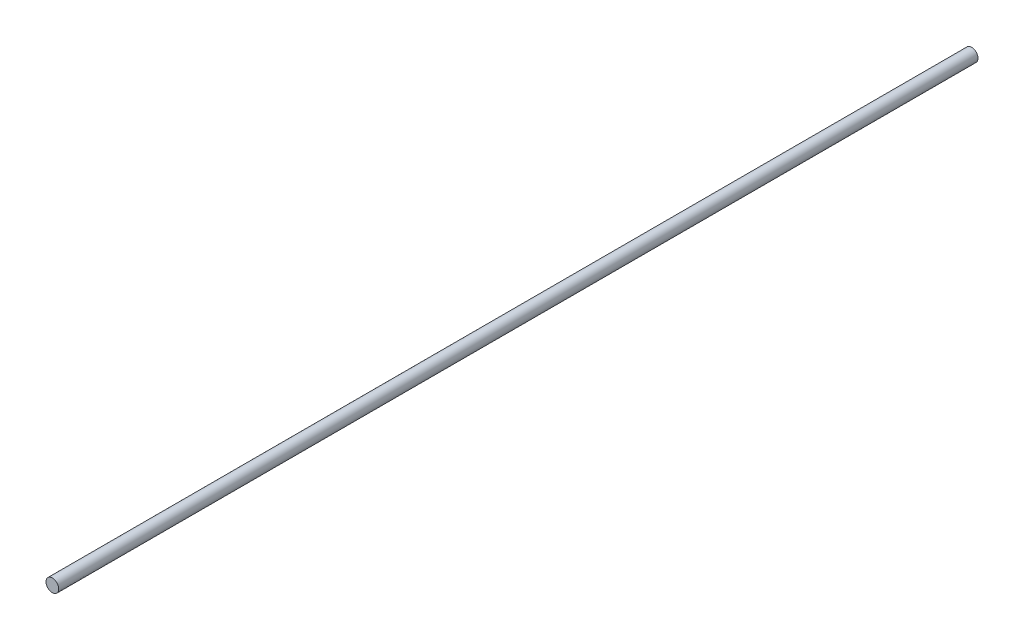
ISO-10303-21;
HEADER;
FILE_DESCRIPTION(('STEP AP214'),'2;1');
FILE_NAME('part.step','',(''),(''),'','','');
FILE_SCHEMA(('AUTOMOTIVE_DESIGN { 1 0 10303 214 1 1 1 1 }'));
ENDSEC;
DATA;
#1=APPLICATION_CONTEXT('core data for automotive mechanical design processes');
#2=APPLICATION_PROTOCOL_DEFINITION('international standard','automotive_design',2000,#1);
#3=PRODUCT_CONTEXT('',#1,'mechanical');
#4=PRODUCT('Part','Part','',(#3));
#5=PRODUCT_RELATED_PRODUCT_CATEGORY('part','',(#4));
#6=PRODUCT_DEFINITION_FORMATION('','',#4);
#7=PRODUCT_DEFINITION_CONTEXT('part definition',#1,'design');
#8=PRODUCT_DEFINITION('design','',#6,#7);
#9=PRODUCT_DEFINITION_SHAPE('','',#8);
#10=(LENGTH_UNIT() NAMED_UNIT(*) SI_UNIT(.MILLI.,.METRE.));
#11=(NAMED_UNIT(*) PLANE_ANGLE_UNIT() SI_UNIT($,.RADIAN.));
#12=(NAMED_UNIT(*) SI_UNIT($,.STERADIAN.) SOLID_ANGLE_UNIT());
#13=UNCERTAINTY_MEASURE_WITH_UNIT(LENGTH_MEASURE(1.E-05),#10,'distance_accuracy_value','');
#14=(GEOMETRIC_REPRESENTATION_CONTEXT(3) GLOBAL_UNCERTAINTY_ASSIGNED_CONTEXT((#13)) GLOBAL_UNIT_ASSIGNED_CONTEXT((#10,
#11,#12)) REPRESENTATION_CONTEXT('',''));
#15=CARTESIAN_POINT('',(0.,0.,0.));
#16=DIRECTION('',(0.,0.,1.));
#17=DIRECTION('',(1.,0.,0.));
#18=AXIS2_PLACEMENT_3D('',#15,#16,#17);
#19=CARTESIAN_POINT('',(0.,0.,203.2));
#20=DIRECTION('',(0.,0.,-1.));
#21=DIRECTION('',(-1.,0.,0.));
#22=AXIS2_PLACEMENT_3D('',#19,#20,#21);
#23=CYLINDRICAL_SURFACE('',#22,1.41111111111111);
#24=CARTESIAN_POINT('',(0.,0.,203.2));
#25=DIRECTION('',(0.,0.,1.));
#26=DIRECTION('',(1.,0.,0.));
#27=AXIS2_PLACEMENT_3D('',#24,#25,#26);
#28=CIRCLE('',#27,1.41111111111111);
#29=CARTESIAN_POINT('',(1.41111111111111,0.,203.2));
#30=VERTEX_POINT('',#29);
#31=EDGE_CURVE('E10',#30,#30,#28,.T.);
#32=ORIENTED_EDGE('',*,*,#31,.F.);
#33=EDGE_LOOP('',(#32));
#34=FACE_BOUND('',#33,.T.);
#35=CARTESIAN_POINT('',(0.,0.,0.));
#36=DIRECTION('',(0.,0.,1.));
#37=DIRECTION('',(1.,0.,0.));
#38=AXIS2_PLACEMENT_3D('',#35,#36,#37);
#39=CIRCLE('',#38,1.41111111111111);
#40=CARTESIAN_POINT('',(1.41111111111111,0.,0.));
#41=VERTEX_POINT('',#40);
#42=EDGE_CURVE('E34',#41,#41,#39,.T.);
#43=ORIENTED_EDGE('',*,*,#42,.T.);
#44=EDGE_LOOP('',(#43));
#45=FACE_BOUND('',#44,.T.);
#46=ADVANCED_FACE('F31',(#34,#45),#23,.T.);
#47=CARTESIAN_POINT('',(0.,0.,203.2));
#48=DIRECTION('',(0.,0.,1.));
#49=DIRECTION('',(1.,0.,0.));
#50=AXIS2_PLACEMENT_3D('',#47,#48,#49);
#51=PLANE('',#50);
#52=ORIENTED_EDGE('',*,*,#31,.T.);
#53=EDGE_LOOP('',(#52));
#54=FACE_BOUND('',#53,.T.);
#55=ADVANCED_FACE('F46',(#54),#51,.T.);
#56=CARTESIAN_POINT('',(0.,0.,0.));
#57=DIRECTION('',(0.,0.,1.));
#58=DIRECTION('',(1.,0.,0.));
#59=AXIS2_PLACEMENT_3D('',#56,#57,#58);
#60=PLANE('',#59);
#61=ORIENTED_EDGE('',*,*,#42,.F.);
#62=EDGE_LOOP('',(#61));
#63=FACE_BOUND('',#62,.T.);
#64=ADVANCED_FACE('F44',(#63),#60,.F.);
#65=CLOSED_SHELL('',(#46,#55,#64));
#66=MANIFOLD_SOLID_BREP('B2',#65);
#67=ADVANCED_BREP_SHAPE_REPRESENTATION('',(#18,#66),#14);
#68=SHAPE_DEFINITION_REPRESENTATION(#9,#67);
ENDSEC;
END-ISO-10303-21;
